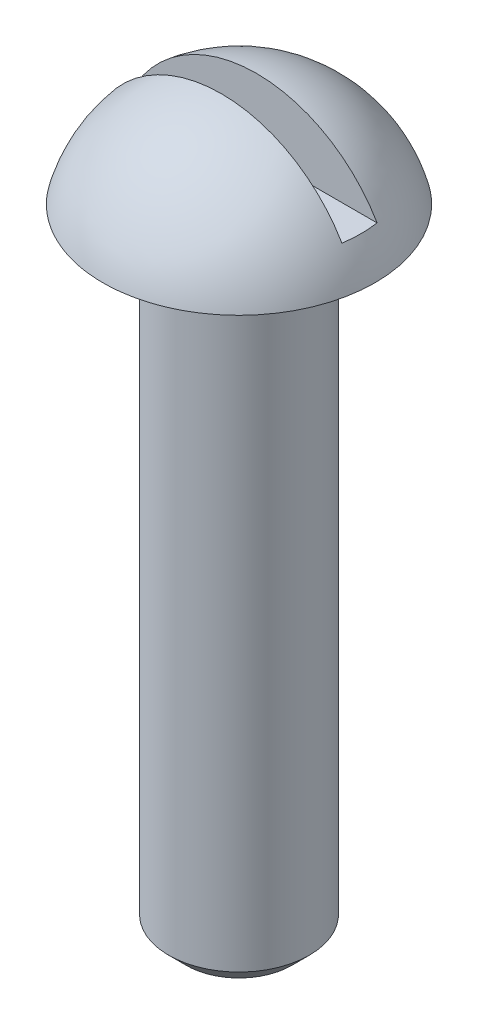
ISO-10303-21;
HEADER;
FILE_DESCRIPTION(('STEP AP214'),'2;1');
FILE_NAME('part.step','',(''),(''),'','','');
FILE_SCHEMA(('AUTOMOTIVE_DESIGN { 1 0 10303 214 1 1 1 1 }'));
ENDSEC;
DATA;
#1=APPLICATION_CONTEXT('core data for automotive mechanical design processes');
#2=APPLICATION_PROTOCOL_DEFINITION('international standard','automotive_design',2000,#1);
#3=PRODUCT_CONTEXT('',#1,'mechanical');
#4=PRODUCT('Part','Part','',(#3));
#5=PRODUCT_RELATED_PRODUCT_CATEGORY('part','',(#4));
#6=PRODUCT_DEFINITION_FORMATION('','',#4);
#7=PRODUCT_DEFINITION_CONTEXT('part definition',#1,'design');
#8=PRODUCT_DEFINITION('design','',#6,#7);
#9=PRODUCT_DEFINITION_SHAPE('','',#8);
#10=(LENGTH_UNIT() NAMED_UNIT(*) SI_UNIT(.MILLI.,.METRE.));
#11=(NAMED_UNIT(*) PLANE_ANGLE_UNIT() SI_UNIT($,.RADIAN.));
#12=(NAMED_UNIT(*) SI_UNIT($,.STERADIAN.) SOLID_ANGLE_UNIT());
#13=UNCERTAINTY_MEASURE_WITH_UNIT(LENGTH_MEASURE(1.E-05),#10,'distance_accuracy_value','');
#14=(GEOMETRIC_REPRESENTATION_CONTEXT(3) GLOBAL_UNCERTAINTY_ASSIGNED_CONTEXT((#13)) GLOBAL_UNIT_ASSIGNED_CONTEXT((#10,
#11,#12)) REPRESENTATION_CONTEXT('',''));
#15=CARTESIAN_POINT('',(0.,0.,0.));
#16=DIRECTION('',(0.,0.,1.));
#17=DIRECTION('',(1.,0.,0.));
#18=AXIS2_PLACEMENT_3D('',#15,#16,#17);
#19=CARTESIAN_POINT('',(2.93649167310371,18.,0.));
#20=DIRECTION('',(0.,-1.,0.));
#21=DIRECTION('',(0.,0.,-1.));
#22=AXIS2_PLACEMENT_3D('',#19,#20,#21);
#23=PLANE('',#22);
#24=CARTESIAN_POINT('',(0.,18.,0.));
#25=DIRECTION('',(0.,-1.,0.));
#26=DIRECTION('',(1.,0.,0.));
#27=AXIS2_PLACEMENT_3D('',#24,#25,#26);
#28=CIRCLE('',#27,3.87298334620742);
#29=CARTESIAN_POINT('',(3.87298334620742,18.,0.));
#30=VERTEX_POINT('',#29);
#31=EDGE_CURVE('E11',#30,#30,#28,.T.);
#32=ORIENTED_EDGE('',*,*,#31,.T.);
#33=EDGE_LOOP('',(#32));
#34=FACE_BOUND('',#33,.T.);
#35=CARTESIAN_POINT('',(0.,18.,0.));
#36=DIRECTION('',(0.,-1.,0.));
#37=DIRECTION('',(1.,0.,0.));
#38=AXIS2_PLACEMENT_3D('',#35,#36,#37);
#39=CIRCLE('',#38,2.);
#40=CARTESIAN_POINT('',(2.,18.,0.));
#41=VERTEX_POINT('',#40);
#42=EDGE_CURVE('E76',#41,#41,#39,.T.);
#43=ORIENTED_EDGE('',*,*,#42,.F.);
#44=EDGE_LOOP('',(#43));
#45=FACE_BOUND('',#44,.T.);
#46=ADVANCED_FACE('F16',(#34,#45),#23,.T.);
#47=CARTESIAN_POINT('',(0.,17.,0.));
#48=DIRECTION('',(0.,0.,1.));
#49=DIRECTION('',(1.,0.,0.));
#50=AXIS2_PLACEMENT_3D('',#47,#48,#49);
#51=SPHERICAL_SURFACE('',#50,4.);
#52=ORIENTED_EDGE('',*,*,#31,.F.);
#53=EDGE_LOOP('',(#52));
#54=FACE_BOUND('',#53,.T.);
#55=CARTESIAN_POINT('',(0.,17.,-0.499999999999994));
#56=DIRECTION('',(0.,0.,-1.));
#57=DIRECTION('',(0.,-1.,0.));
#58=AXIS2_PLACEMENT_3D('',#55,#56,#57);
#59=CIRCLE('',#58,3.96862696659689);
#60=CARTESIAN_POINT('',(-3.42782730020052,19.,-0.5));
#61=VERTEX_POINT('',#60);
#62=CARTESIAN_POINT('',(3.42782730020052,19.,-0.5));
#63=VERTEX_POINT('',#62);
#64=EDGE_CURVE('E74',#61,#63,#59,.T.);
#65=ORIENTED_EDGE('',*,*,#64,.T.);
#66=CARTESIAN_POINT('',(0.,19.,0.));
#67=DIRECTION('',(0.,-1.,0.));
#68=DIRECTION('',(0.,0.,1.));
#69=AXIS2_PLACEMENT_3D('',#66,#67,#68);
#70=CIRCLE('',#69,3.46410161513775);
#71=CARTESIAN_POINT('',(3.42782730020052,19.,0.5));
#72=VERTEX_POINT('',#71);
#73=EDGE_CURVE('E20',#63,#72,#70,.T.);
#74=ORIENTED_EDGE('',*,*,#73,.T.);
#75=CARTESIAN_POINT('',(0.,17.,0.499999999999994));
#76=DIRECTION('',(0.,0.,1.));
#77=DIRECTION('',(0.,1.,0.));
#78=AXIS2_PLACEMENT_3D('',#75,#76,#77);
#79=CIRCLE('',#78,3.96862696659689);
#80=CARTESIAN_POINT('',(-3.42782730020052,19.,0.5));
#81=VERTEX_POINT('',#80);
#82=EDGE_CURVE('E72',#72,#81,#79,.T.);
#83=ORIENTED_EDGE('',*,*,#82,.T.);
#84=CARTESIAN_POINT('',(0.,19.,0.));
#85=DIRECTION('',(0.,-1.,0.));
#86=DIRECTION('',(0.,0.,1.));
#87=AXIS2_PLACEMENT_3D('',#84,#85,#86);
#88=CIRCLE('',#87,3.46410161513775);
#89=EDGE_CURVE('E27',#81,#61,#88,.T.);
#90=ORIENTED_EDGE('',*,*,#89,.T.);
#91=EDGE_LOOP('',(#65,#74,#83,#90));
#92=FACE_BOUND('',#91,.T.);
#93=ADVANCED_FACE('F75',(#54,#92),#51,.T.);
#94=CARTESIAN_POINT('',(0.,19.,-0.5));
#95=DIRECTION('',(0.,-1.,0.));
#96=DIRECTION('',(0.,0.,-1.));
#97=AXIS2_PLACEMENT_3D('',#94,#95,#96);
#98=PLANE('',#97);
#99=ORIENTED_EDGE('',*,*,#73,.F.);
#100=DIRECTION('',(1.,0.,0.));
#101=VECTOR('',#100,1.);
#102=CARTESIAN_POINT('',(0.,19.,-0.5));
#103=LINE('',#102,#101);
#104=EDGE_CURVE('E67',#61,#63,#103,.T.);
#105=ORIENTED_EDGE('',*,*,#104,.F.);
#106=ORIENTED_EDGE('',*,*,#89,.F.);
#107=DIRECTION('',(1.,0.,0.));
#108=VECTOR('',#107,1.);
#109=CARTESIAN_POINT('',(0.,19.,0.5));
#110=LINE('',#109,#108);
#111=EDGE_CURVE('E64',#81,#72,#110,.T.);
#112=ORIENTED_EDGE('',*,*,#111,.T.);
#113=EDGE_LOOP('',(#99,#105,#106,#112));
#114=FACE_BOUND('',#113,.T.);
#115=ADVANCED_FACE('F63',(#114),#98,.F.);
#116=CARTESIAN_POINT('',(0.,21.,-0.5));
#117=DIRECTION('',(0.,0.,-1.));
#118=DIRECTION('',(-1.,0.,0.));
#119=AXIS2_PLACEMENT_3D('',#116,#117,#118);
#120=PLANE('',#119);
#121=ORIENTED_EDGE('',*,*,#64,.F.);
#122=ORIENTED_EDGE('',*,*,#104,.T.);
#123=EDGE_LOOP('',(#121,#122));
#124=FACE_BOUND('',#123,.T.);
#125=ADVANCED_FACE('F86',(#124),#120,.F.);
#126=CARTESIAN_POINT('',(0.,19.,0.5));
#127=DIRECTION('',(0.,0.,1.));
#128=DIRECTION('',(1.,0.,0.));
#129=AXIS2_PLACEMENT_3D('',#126,#127,#128);
#130=PLANE('',#129);
#131=ORIENTED_EDGE('',*,*,#82,.F.);
#132=ORIENTED_EDGE('',*,*,#111,.F.);
#133=EDGE_LOOP('',(#131,#132));
#134=FACE_BOUND('',#133,.T.);
#135=ADVANCED_FACE('F71',(#134),#130,.F.);
#136=CARTESIAN_POINT('',(1.,0.,0.));
#137=DIRECTION('',(0.,-1.,0.));
#138=DIRECTION('',(0.,0.,-1.));
#139=AXIS2_PLACEMENT_3D('',#136,#137,#138);
#140=PLANE('',#139);
#141=CARTESIAN_POINT('',(0.,0.,0.));
#142=DIRECTION('',(0.,1.,0.));
#143=DIRECTION('',(-1.,0.,0.));
#144=AXIS2_PLACEMENT_3D('',#141,#142,#143);
#145=CIRCLE('',#144,1.5);
#146=CARTESIAN_POINT('',(1.5,0.,0.));
#147=VERTEX_POINT('',#146);
#148=EDGE_CURVE('E46',#147,#147,#145,.T.);
#149=ORIENTED_EDGE('',*,*,#148,.F.);
#150=EDGE_LOOP('',(#149));
#151=FACE_BOUND('',#150,.T.);
#152=ADVANCED_FACE('F18',(#151),#140,.T.);
#153=CARTESIAN_POINT('',(0.,9.,0.));
#154=DIRECTION('',(0.,1.,0.));
#155=DIRECTION('',(1.,0.,0.));
#156=AXIS2_PLACEMENT_3D('',#153,#154,#155);
#157=CYLINDRICAL_SURFACE('',#156,2.);
#158=CARTESIAN_POINT('',(0.,0.5,0.));
#159=DIRECTION('',(0.,-1.,0.));
#160=DIRECTION('',(-1.,0.,0.));
#161=AXIS2_PLACEMENT_3D('',#158,#159,#160);
#162=CIRCLE('',#161,2.);
#163=CARTESIAN_POINT('',(2.,0.5,0.));
#164=VERTEX_POINT('',#163);
#165=EDGE_CURVE('E51',#164,#164,#162,.T.);
#166=ORIENTED_EDGE('',*,*,#165,.F.);
#167=EDGE_LOOP('',(#166));
#168=FACE_BOUND('',#167,.T.);
#169=ORIENTED_EDGE('',*,*,#42,.T.);
#170=EDGE_LOOP('',(#169));
#171=FACE_BOUND('',#170,.T.);
#172=ADVANCED_FACE('F107',(#168,#171),#157,.T.);
#173=CARTESIAN_POINT('',(0.,0.25,0.));
#174=DIRECTION('',(0.,1.,0.));
#175=DIRECTION('',(-1.,0.,0.));
#176=AXIS2_PLACEMENT_3D('',#173,#174,#175);
#177=CONICAL_SURFACE('',#176,1.75,0.785398163397445);
#178=ORIENTED_EDGE('',*,*,#148,.T.);
#179=EDGE_LOOP('',(#178));
#180=FACE_BOUND('',#179,.T.);
#181=ORIENTED_EDGE('',*,*,#165,.T.);
#182=EDGE_LOOP('',(#181));
#183=FACE_BOUND('',#182,.T.);
#184=ADVANCED_FACE('F104',(#180,#183),#177,.T.);
#185=CLOSED_SHELL('',(#46,#93,#115,#125,#135,#152,#172,#184));
#186=MANIFOLD_SOLID_BREP('B1',#185);
#187=ADVANCED_BREP_SHAPE_REPRESENTATION('',(#18,#186),#14);
#188=SHAPE_DEFINITION_REPRESENTATION(#9,#187);
ENDSEC;
END-ISO-10303-21;
